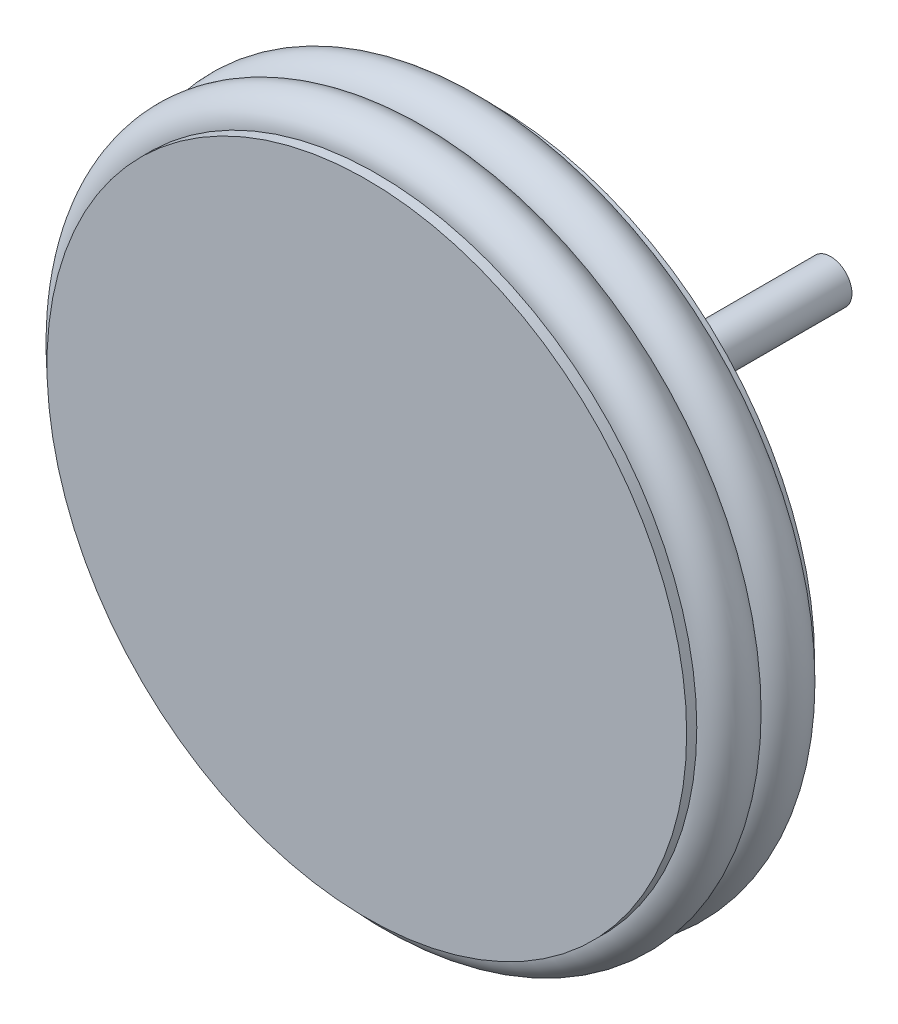
ISO-10303-21;
HEADER;
FILE_DESCRIPTION(('STEP AP214'),'2;1');
FILE_NAME('part.step','',(''),(''),'','','');
FILE_SCHEMA(('AUTOMOTIVE_DESIGN { 1 0 10303 214 1 1 1 1 }'));
ENDSEC;
DATA;
#1=APPLICATION_CONTEXT('core data for automotive mechanical design processes');
#2=APPLICATION_PROTOCOL_DEFINITION('international standard','automotive_design',2000,#1);
#3=PRODUCT_CONTEXT('',#1,'mechanical');
#4=PRODUCT('Part','Part','',(#3));
#5=PRODUCT_RELATED_PRODUCT_CATEGORY('part','',(#4));
#6=PRODUCT_DEFINITION_FORMATION('','',#4);
#7=PRODUCT_DEFINITION_CONTEXT('part definition',#1,'design');
#8=PRODUCT_DEFINITION('design','',#6,#7);
#9=PRODUCT_DEFINITION_SHAPE('','',#8);
#10=(LENGTH_UNIT() NAMED_UNIT(*) SI_UNIT(.MILLI.,.METRE.));
#11=(NAMED_UNIT(*) PLANE_ANGLE_UNIT() SI_UNIT($,.RADIAN.));
#12=(NAMED_UNIT(*) SI_UNIT($,.STERADIAN.) SOLID_ANGLE_UNIT());
#13=UNCERTAINTY_MEASURE_WITH_UNIT(LENGTH_MEASURE(1.E-05),#10,'distance_accuracy_value','');
#14=(GEOMETRIC_REPRESENTATION_CONTEXT(3) GLOBAL_UNCERTAINTY_ASSIGNED_CONTEXT((#13)) GLOBAL_UNIT_ASSIGNED_CONTEXT((#10,
#11,#12)) REPRESENTATION_CONTEXT('',''));
#15=CARTESIAN_POINT('',(0.,0.,0.));
#16=DIRECTION('',(0.,0.,1.));
#17=DIRECTION('',(1.,0.,0.));
#18=AXIS2_PLACEMENT_3D('',#15,#16,#17);
#19=CARTESIAN_POINT('',(0.,0.,-5.));
#20=DIRECTION('',(0.,0.,-1.));
#21=DIRECTION('',(-1.,0.,0.));
#22=AXIS2_PLACEMENT_3D('',#19,#20,#21);
#23=CYLINDRICAL_SURFACE('',#22,60.);
#24=CARTESIAN_POINT('',(0.,0.,-5.));
#25=DIRECTION('',(0.,0.,1.));
#26=DIRECTION('',(1.,0.,0.));
#27=AXIS2_PLACEMENT_3D('',#24,#25,#26);
#28=CIRCLE('',#27,60.);
#29=CARTESIAN_POINT('',(60.,0.,-5.));
#30=VERTEX_POINT('',#29);
#31=EDGE_CURVE('E92',#30,#30,#28,.T.);
#32=ORIENTED_EDGE('',*,*,#31,.F.);
#33=EDGE_LOOP('',(#32));
#34=FACE_BOUND('',#33,.T.);
#35=CARTESIAN_POINT('',(0.,0.,-7.));
#36=DIRECTION('',(0.,0.,1.));
#37=DIRECTION('',(1.,0.,0.));
#38=AXIS2_PLACEMENT_3D('',#35,#36,#37);
#39=CIRCLE('',#38,60.);
#40=CARTESIAN_POINT('',(60.,0.,-7.));
#41=VERTEX_POINT('',#40);
#42=EDGE_CURVE('E83',#41,#41,#39,.T.);
#43=ORIENTED_EDGE('',*,*,#42,.T.);
#44=EDGE_LOOP('',(#43));
#45=FACE_BOUND('',#44,.T.);
#46=ADVANCED_FACE('F80',(#34,#45),#23,.T.);
#47=CARTESIAN_POINT('',(0.,0.,-5.));
#48=DIRECTION('',(0.,0.,1.));
#49=DIRECTION('',(1.,0.,0.));
#50=AXIS2_PLACEMENT_3D('',#47,#48,#49);
#51=PLANE('',#50);
#52=ORIENTED_EDGE('',*,*,#31,.T.);
#53=EDGE_LOOP('',(#52));
#54=FACE_BOUND('',#53,.T.);
#55=ADVANCED_FACE('F109',(#54),#51,.T.);
#56=CARTESIAN_POINT('',(0.,0.,-7.));
#57=DIRECTION('',(0.,0.,1.));
#58=DIRECTION('',(1.,0.,0.));
#59=AXIS2_PLACEMENT_3D('',#56,#57,#58);
#60=PLANE('',#59);
#61=CARTESIAN_POINT('',(0.,0.,-7.));
#62=DIRECTION('',(0.,0.,-1.));
#63=DIRECTION('',(-1.,0.,0.));
#64=AXIS2_PLACEMENT_3D('',#61,#62,#63);
#65=CIRCLE('',#64,20.);
#66=CARTESIAN_POINT('',(-20.,0.,-7.));
#67=VERTEX_POINT('',#66);
#68=EDGE_CURVE('E87',#67,#67,#65,.T.);
#69=ORIENTED_EDGE('',*,*,#68,.F.);
#70=EDGE_LOOP('',(#69));
#71=FACE_BOUND('',#70,.T.);
#72=ORIENTED_EDGE('',*,*,#42,.F.);
#73=EDGE_LOOP('',(#72));
#74=FACE_BOUND('',#73,.T.);
#75=ADVANCED_FACE('F106',(#71,#74),#60,.F.);
#76=CARTESIAN_POINT('',(0.,0.,-10.));
#77=DIRECTION('',(0.,0.,1.));
#78=DIRECTION('',(1.,0.,0.));
#79=AXIS2_PLACEMENT_3D('',#76,#77,#78);
#80=CYLINDRICAL_SURFACE('',#79,20.);
#81=CARTESIAN_POINT('',(0.,0.,-10.));
#82=DIRECTION('',(0.,0.,-1.));
#83=DIRECTION('',(-1.,0.,0.));
#84=AXIS2_PLACEMENT_3D('',#81,#82,#83);
#85=CIRCLE('',#84,20.);
#86=CARTESIAN_POINT('',(-20.,0.,-10.));
#87=VERTEX_POINT('',#86);
#88=EDGE_CURVE('E97',#87,#87,#85,.T.);
#89=ORIENTED_EDGE('',*,*,#88,.F.);
#90=EDGE_LOOP('',(#89));
#91=FACE_BOUND('',#90,.T.);
#92=ORIENTED_EDGE('',*,*,#68,.T.);
#93=EDGE_LOOP('',(#92));
#94=FACE_BOUND('',#93,.T.);
#95=ADVANCED_FACE('F108',(#91,#94),#80,.T.);
#96=CARTESIAN_POINT('',(0.,0.,-10.));
#97=DIRECTION('',(0.,0.,-1.));
#98=DIRECTION('',(-1.,0.,0.));
#99=AXIS2_PLACEMENT_3D('',#96,#97,#98);
#100=PLANE('',#99);
#101=CARTESIAN_POINT('',(0.,0.,-10.));
#102=DIRECTION('',(0.,0.,-1.));
#103=DIRECTION('',(-1.,0.,0.));
#104=AXIS2_PLACEMENT_3D('',#101,#102,#103);
#105=CIRCLE('',#104,4.);
#106=CARTESIAN_POINT('',(4.,0.,-10.));
#107=VERTEX_POINT('',#106);
#108=EDGE_CURVE('E12',#107,#107,#105,.T.);
#109=ORIENTED_EDGE('',*,*,#108,.F.);
#110=EDGE_LOOP('',(#109));
#111=FACE_BOUND('',#110,.T.);
#112=ORIENTED_EDGE('',*,*,#88,.T.);
#113=EDGE_LOOP('',(#112));
#114=FACE_BOUND('',#113,.T.);
#115=ADVANCED_FACE('F115',(#111,#114),#100,.T.);
#116=CARTESIAN_POINT('',(0.,0.,-70.));
#117=DIRECTION('',(0.,0.,1.));
#118=DIRECTION('',(1.,0.,0.));
#119=AXIS2_PLACEMENT_3D('',#116,#117,#118);
#120=CYLINDRICAL_SURFACE('',#119,4.);
#121=CARTESIAN_POINT('',(0.,0.,-70.));
#122=DIRECTION('',(0.,0.,-1.));
#123=DIRECTION('',(-1.,0.,0.));
#124=AXIS2_PLACEMENT_3D('',#121,#122,#123);
#125=CIRCLE('',#124,4.);
#126=CARTESIAN_POINT('',(4.,0.,-70.));
#127=VERTEX_POINT('',#126);
#128=EDGE_CURVE('E96',#127,#127,#125,.T.);
#129=CARTESIAN_POINT('',(4.,0.,-70.));
#130=CARTESIAN_POINT('',(4.,0.,-69.375));
#131=CARTESIAN_POINT('',(4.,0.,-68.75));
#132=CARTESIAN_POINT('',(4.,0.,-67.5));
#133=CARTESIAN_POINT('',(4.,0.,-66.875));
#134=CARTESIAN_POINT('',(4.,0.,-65.625));
#135=CARTESIAN_POINT('',(4.,0.,-65.));
#136=CARTESIAN_POINT('',(4.,0.,-63.75));
#137=CARTESIAN_POINT('',(4.,0.,-63.125));
#138=CARTESIAN_POINT('',(4.,0.,-61.875));
#139=CARTESIAN_POINT('',(4.,0.,-61.25));
#140=CARTESIAN_POINT('',(4.,0.,-60.));
#141=CARTESIAN_POINT('',(4.,0.,-59.375));
#142=CARTESIAN_POINT('',(4.,0.,-58.125));
#143=CARTESIAN_POINT('',(4.,0.,-57.5));
#144=CARTESIAN_POINT('',(4.,0.,-56.25));
#145=CARTESIAN_POINT('',(4.,0.,-55.625));
#146=CARTESIAN_POINT('',(4.,0.,-54.375));
#147=CARTESIAN_POINT('',(4.,0.,-53.75));
#148=CARTESIAN_POINT('',(4.,0.,-52.5));
#149=CARTESIAN_POINT('',(4.,0.,-51.875));
#150=CARTESIAN_POINT('',(4.,0.,-50.625));
#151=CARTESIAN_POINT('',(4.,0.,-50.));
#152=CARTESIAN_POINT('',(4.,0.,-48.75));
#153=CARTESIAN_POINT('',(4.,0.,-48.125));
#154=CARTESIAN_POINT('',(4.,0.,-46.875));
#155=CARTESIAN_POINT('',(4.,0.,-46.25));
#156=CARTESIAN_POINT('',(4.,0.,-45.));
#157=CARTESIAN_POINT('',(4.,0.,-44.375));
#158=CARTESIAN_POINT('',(4.,0.,-43.125));
#159=CARTESIAN_POINT('',(4.,0.,-42.5));
#160=CARTESIAN_POINT('',(4.,0.,-41.25));
#161=CARTESIAN_POINT('',(4.,0.,-40.625));
#162=CARTESIAN_POINT('',(4.,0.,-39.375));
#163=CARTESIAN_POINT('',(4.,0.,-38.75));
#164=CARTESIAN_POINT('',(4.,0.,-37.5));
#165=CARTESIAN_POINT('',(4.,0.,-36.875));
#166=CARTESIAN_POINT('',(4.,0.,-35.625));
#167=CARTESIAN_POINT('',(4.,0.,-35.));
#168=CARTESIAN_POINT('',(4.,0.,-33.75));
#169=CARTESIAN_POINT('',(4.,0.,-33.125));
#170=CARTESIAN_POINT('',(4.,0.,-31.875));
#171=CARTESIAN_POINT('',(4.,0.,-31.25));
#172=CARTESIAN_POINT('',(4.,0.,-30.));
#173=CARTESIAN_POINT('',(4.,0.,-29.375));
#174=CARTESIAN_POINT('',(4.,0.,-28.125));
#175=CARTESIAN_POINT('',(4.,0.,-27.5));
#176=CARTESIAN_POINT('',(4.,0.,-26.25));
#177=CARTESIAN_POINT('',(4.,0.,-25.625));
#178=CARTESIAN_POINT('',(4.,0.,-24.375));
#179=CARTESIAN_POINT('',(4.,0.,-23.75));
#180=CARTESIAN_POINT('',(4.,0.,-22.5));
#181=CARTESIAN_POINT('',(4.,0.,-21.875));
#182=CARTESIAN_POINT('',(4.,0.,-20.625));
#183=CARTESIAN_POINT('',(4.,0.,-20.));
#184=CARTESIAN_POINT('',(4.,0.,-18.75));
#185=CARTESIAN_POINT('',(4.,0.,-18.125));
#186=CARTESIAN_POINT('',(4.,0.,-16.875));
#187=CARTESIAN_POINT('',(4.,0.,-16.25));
#188=CARTESIAN_POINT('',(4.,0.,-15.));
#189=CARTESIAN_POINT('',(4.,0.,-14.375));
#190=CARTESIAN_POINT('',(4.,0.,-13.125));
#191=CARTESIAN_POINT('',(4.,0.,-12.5));
#192=CARTESIAN_POINT('',(4.,0.,-11.25));
#193=CARTESIAN_POINT('',(4.,0.,-10.625));
#194=CARTESIAN_POINT('',(4.,0.,-10.));
#195=B_SPLINE_CURVE_WITH_KNOTS('',3,(#129,#130,#131,#132,#133,#134,#135,#136,#137,#138,#139,
#140,#141,#142,#143,#144,#145,#146,#147,#148,#149,#150,#151,#152,#153,#154,#155,#156,#157,#158,
#159,#160,#161,#162,#163,#164,#165,#166,#167,#168,#169,#170,#171,#172,#173,#174,#175,#176,#177,
#178,#179,#180,#181,#182,#183,#184,#185,#186,#187,#188,#189,#190,#191,#192,#193,#194),
.UNSPECIFIED.,.F.,.F.,(4,2,2,2,2,2,2,2,2,2,2,2,2,2,2,2,2,2,2,2,2,2,2,2,2,2,2,2,2,2,2,2,4),(0.,
1.87499999999999,3.74999999999999,5.62499999999999,7.49999999999999,9.37499999999999,11.25,
13.125,15.,16.875,18.75,20.625,22.5,24.375,26.25,28.125,30.,31.875,33.75,35.625,37.5,39.375,
41.25,43.125,45.,46.875,48.75,50.625,52.5,54.375,56.25,58.125,60.),.UNSPECIFIED.);
#196=EDGE_CURVE('BSEAM147',#127,#107,#195,.T.);
#197=ORIENTED_EDGE('',*,*,#128,.F.);
#198=ORIENTED_EDGE('',*,*,#108,.T.);
#199=ORIENTED_EDGE('',*,*,#196,.T.);
#200=ORIENTED_EDGE('',*,*,#196,.F.);
#201=EDGE_LOOP('',(#197,#199,#198,#200));
#202=FACE_BOUND('',#201,.T.);
#203=ADVANCED_FACE('F147',(#202),#120,.T.);
#204=CARTESIAN_POINT('',(0.,0.,-70.));
#205=DIRECTION('',(0.,0.,-1.));
#206=DIRECTION('',(-1.,0.,0.));
#207=AXIS2_PLACEMENT_3D('',#204,#205,#206);
#208=PLANE('',#207);
#209=ORIENTED_EDGE('',*,*,#128,.T.);
#210=EDGE_LOOP('',(#209));
#211=FACE_BOUND('',#210,.T.);
#212=ADVANCED_FACE('F157',(#211),#208,.T.);
#213=CLOSED_SHELL('',(#46,#55,#75,#95,#115,#203,#212));
#214=MANIFOLD_SOLID_BREP('B2',#213);
#215=CARTESIAN_POINT('',(0.,0.,17.));
#216=DIRECTION('',(0.,0.,-1.));
#217=DIRECTION('',(-1.,0.,0.));
#218=AXIS2_PLACEMENT_3D('',#215,#216,#217);
#219=CYLINDRICAL_SURFACE('',#218,60.);
#220=CARTESIAN_POINT('',(0.,0.,15.1));
#221=DIRECTION('',(0.,0.,-1.));
#222=DIRECTION('',(-1.,0.,0.));
#223=AXIS2_PLACEMENT_3D('',#220,#221,#222);
#224=CIRCLE('',#223,60.);
#225=CARTESIAN_POINT('',(60.,0.,15.1));
#226=VERTEX_POINT('',#225);
#227=EDGE_CURVE('E239',#226,#226,#224,.F.);
#228=ORIENTED_EDGE('',*,*,#227,.T.);
#229=EDGE_LOOP('',(#228));
#230=FACE_BOUND('',#229,.T.);
#231=CARTESIAN_POINT('',(0.,0.,17.));
#232=DIRECTION('',(0.,0.,1.));
#233=DIRECTION('',(1.,0.,0.));
#234=AXIS2_PLACEMENT_3D('',#231,#232,#233);
#235=CIRCLE('',#234,60.);
#236=CARTESIAN_POINT('',(60.,0.,17.));
#237=VERTEX_POINT('',#236);
#238=EDGE_CURVE('E229',#237,#237,#235,.T.);
#239=ORIENTED_EDGE('',*,*,#238,.F.);
#240=EDGE_LOOP('',(#239));
#241=FACE_BOUND('',#240,.T.);
#242=ADVANCED_FACE('F222',(#230,#241),#219,.T.);
#243=CARTESIAN_POINT('',(0.,0.,17.));
#244=DIRECTION('',(0.,0.,1.));
#245=DIRECTION('',(1.,0.,0.));
#246=AXIS2_PLACEMENT_3D('',#243,#244,#245);
#247=PLANE('',#246);
#248=ORIENTED_EDGE('',*,*,#238,.T.);
#249=EDGE_LOOP('',(#248));
#250=FACE_BOUND('',#249,.T.);
#251=ADVANCED_FACE('F245',(#250),#247,.T.);
#252=CARTESIAN_POINT('',(0.,0.,10.1));
#253=DIRECTION('',(0.,0.,1.));
#254=DIRECTION('',(1.,0.,0.));
#255=AXIS2_PLACEMENT_3D('',#252,#253,#254);
#256=TOROIDAL_SURFACE('',#255,60.,5.);
#257=ORIENTED_EDGE('',*,*,#227,.F.);
#258=CARTESIAN_POINT('',(60.,0.,10.1));
#259=DIRECTION('',(0.,1.,0.));
#260=DIRECTION('',(-1.,0.,0.));
#261=AXIS2_PLACEMENT_3D('',#258,#259,#260);
#262=CIRCLE('',#261,5.);
#263=CARTESIAN_POINT('',(59.0050125628934,0.,15.));
#264=VERTEX_POINT('',#263);
#265=EDGE_CURVE('E236',#226,#264,#262,.T.);
#266=ORIENTED_EDGE('',*,*,#265,.T.);
#267=CARTESIAN_POINT('',(0.,0.,15.));
#268=DIRECTION('',(0.,0.,-1.));
#269=DIRECTION('',(-1.,0.,0.));
#270=AXIS2_PLACEMENT_3D('',#267,#268,#269);
#271=CIRCLE('',#270,59.0050125628934);
#272=EDGE_CURVE('E78',#264,#264,#271,.T.);
#273=ORIENTED_EDGE('',*,*,#272,.F.);
#274=ORIENTED_EDGE('',*,*,#265,.F.);
#275=EDGE_LOOP('',(#257,#266,#273,#274));
#276=FACE_BOUND('',#275,.T.);
#277=ADVANCED_FACE('F237',(#276),#256,.T.);
#278=CARTESIAN_POINT('',(0.,0.,15.));
#279=DIRECTION('',(0.,0.,1.));
#280=DIRECTION('',(1.,0.,0.));
#281=AXIS2_PLACEMENT_3D('',#278,#279,#280);
#282=PLANE('',#281);
#283=ORIENTED_EDGE('',*,*,#272,.T.);
#284=EDGE_LOOP('',(#283));
#285=FACE_BOUND('',#284,.T.);
#286=ADVANCED_FACE('F257',(#285),#282,.F.);
#287=CLOSED_SHELL('',(#242,#251,#277,#286));
#288=MANIFOLD_SOLID_BREP('B7',#287);
#289=CARTESIAN_POINT('',(0.,0.,0.));
#290=DIRECTION('',(0.,0.,1.));
#291=DIRECTION('',(1.,0.,0.));
#292=AXIS2_PLACEMENT_3D('',#289,#290,#291);
#293=TOROIDAL_SURFACE('',#292,60.,5.);
#294=CARTESIAN_POINT('',(60.,0.,0.));
#295=DIRECTION('',(0.,1.,0.));
#296=DIRECTION('',(-1.,0.,0.));
#297=AXIS2_PLACEMENT_3D('',#294,#295,#296);
#298=CIRCLE('',#297,5.);
#299=CARTESIAN_POINT('',(65.,0.,0.));
#300=VERTEX_POINT('',#299);
#301=EDGE_CURVE('E221',#300,#300,#298,.T.);
#302=CARTESIAN_POINT('',(0.,0.,0.));
#303=DIRECTION('',(0.,0.,1.));
#304=DIRECTION('',(1.,0.,0.));
#305=AXIS2_PLACEMENT_3D('',#302,#303,#304);
#306=CIRCLE('',#305,65.);
#307=EDGE_CURVE('',#300,#300,#306,.T.);
#308=ORIENTED_EDGE('',*,*,#301,.T.);
#309=ORIENTED_EDGE('',*,*,#301,.F.);
#310=ORIENTED_EDGE('',*,*,#307,.T.);
#311=ORIENTED_EDGE('',*,*,#307,.F.);
#312=EDGE_LOOP('',(#308,#310,#309,#311));
#313=FACE_BOUND('',#312,.T.);
#314=ADVANCED_FACE('F295',(#313),#293,.T.);
#315=CLOSED_SHELL('',(#314));
#316=MANIFOLD_SOLID_BREP('B72',#315);
#317=ADVANCED_BREP_SHAPE_REPRESENTATION('',(#18,#214,#288,#316),#14);
#318=SHAPE_DEFINITION_REPRESENTATION(#9,#317);
ENDSEC;
END-ISO-10303-21;
